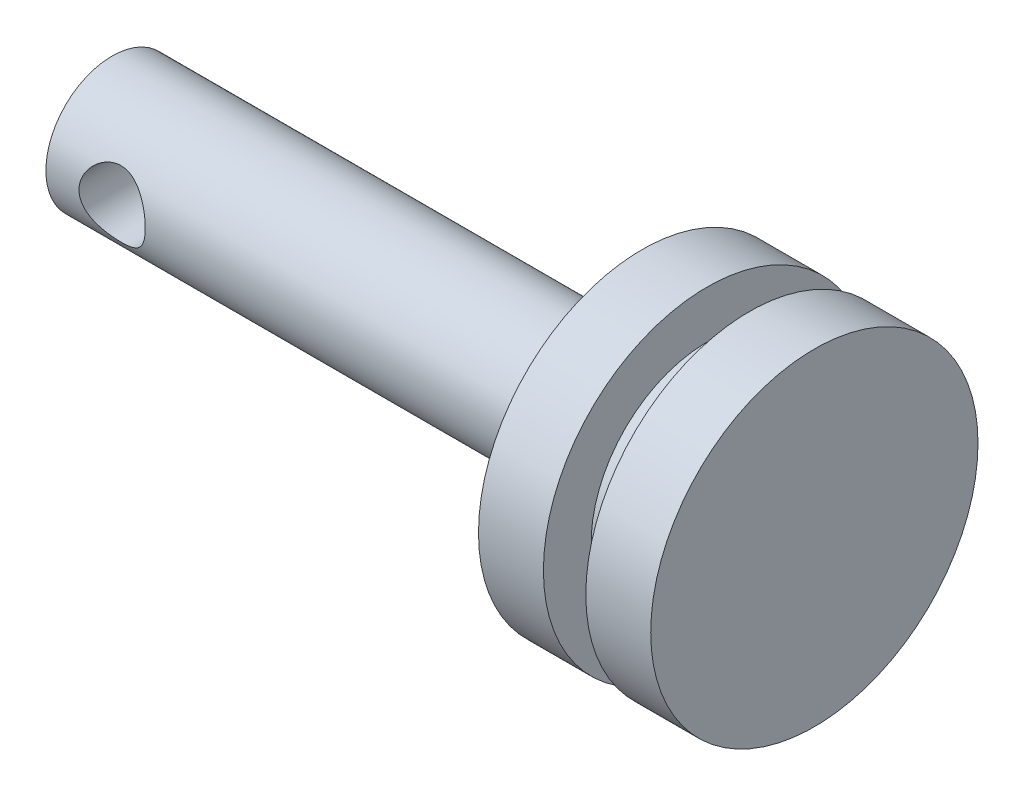
ISO-10303-21;
HEADER;
FILE_DESCRIPTION(('STEP AP214'),'2;1');
FILE_NAME('part.step','',(''),(''),'','','');
FILE_SCHEMA(('AUTOMOTIVE_DESIGN { 1 0 10303 214 1 1 1 1 }'));
ENDSEC;
DATA;
#1=APPLICATION_CONTEXT('core data for automotive mechanical design processes');
#2=APPLICATION_PROTOCOL_DEFINITION('international standard','automotive_design',2000,#1);
#3=PRODUCT_CONTEXT('',#1,'mechanical');
#4=PRODUCT('Part','Part','',(#3));
#5=PRODUCT_RELATED_PRODUCT_CATEGORY('part','',(#4));
#6=PRODUCT_DEFINITION_FORMATION('','',#4);
#7=PRODUCT_DEFINITION_CONTEXT('part definition',#1,'design');
#8=PRODUCT_DEFINITION('design','',#6,#7);
#9=PRODUCT_DEFINITION_SHAPE('','',#8);
#10=(LENGTH_UNIT() NAMED_UNIT(*) SI_UNIT(.MILLI.,.METRE.));
#11=(NAMED_UNIT(*) PLANE_ANGLE_UNIT() SI_UNIT($,.RADIAN.));
#12=(NAMED_UNIT(*) SI_UNIT($,.STERADIAN.) SOLID_ANGLE_UNIT());
#13=UNCERTAINTY_MEASURE_WITH_UNIT(LENGTH_MEASURE(1.E-05),#10,'distance_accuracy_value','');
#14=(GEOMETRIC_REPRESENTATION_CONTEXT(3) GLOBAL_UNCERTAINTY_ASSIGNED_CONTEXT((#13)) GLOBAL_UNIT_ASSIGNED_CONTEXT((#10,
#11,#12)) REPRESENTATION_CONTEXT('',''));
#15=CARTESIAN_POINT('',(0.,0.,0.));
#16=DIRECTION('',(0.,0.,1.));
#17=DIRECTION('',(1.,0.,0.));
#18=AXIS2_PLACEMENT_3D('',#15,#16,#17);
#19=CARTESIAN_POINT('',(53.,0.,0.));
#20=DIRECTION('',(1.,0.,0.));
#21=DIRECTION('',(0.,0.,-1.));
#22=AXIS2_PLACEMENT_3D('',#19,#20,#21);
#23=CYLINDRICAL_SURFACE('',#22,5.);
#24=CARTESIAN_POINT('',(2.5,0.,5.));
#25=CARTESIAN_POINT('',(2.50000966905601,0.131426682334305,4.99999177550472));
#26=CARTESIAN_POINT('',(2.51042556177403,0.263015634437212,4.99476199135277));
#27=CARTESIAN_POINT('',(2.55163182116205,0.522301454622882,4.9743541856102));
#28=CARTESIAN_POINT('',(2.58246088092502,0.649990448564104,4.9591572718767));
#29=CARTESIAN_POINT('',(2.66298462271884,0.897333631316202,4.92040690922477));
#30=CARTESIAN_POINT('',(2.71260598778273,1.01701694536277,4.89688595907259));
#31=CARTESIAN_POINT('',(2.8289265262518,1.24618160399671,4.84364443325827));
#32=CARTESIAN_POINT('',(2.89562435314509,1.3556637520377,4.81392434644421));
#33=CARTESIAN_POINT('',(3.04879313164263,1.56876952630998,4.74890645050632));
#34=CARTESIAN_POINT('',(3.13621620022978,1.67163802294308,4.71337997659091));
#35=CARTESIAN_POINT('',(3.32630369598529,1.86194861703332,4.64149925776731));
#36=CARTESIAN_POINT('',(3.42897962884011,1.94937895911555,4.60514440566897));
#37=CARTESIAN_POINT('',(3.65620837444528,2.11312999967247,4.53247377945622));
#38=CARTESIAN_POINT('',(3.78184024603501,2.18806333849064,4.49637967412567));
#39=CARTESIAN_POINT('',(4.04591833979543,2.31542056761491,4.43214946943555));
#40=CARTESIAN_POINT('',(4.18435532176262,2.36786053751682,4.40400769020792));
#41=CARTESIAN_POINT('',(4.46166276359641,2.44533110537653,4.36144667591402));
#42=CARTESIAN_POINT('',(4.60001113017958,2.47181464267578,4.34630678958452));
#43=CARTESIAN_POINT('',(4.87994709443761,2.50106748329741,4.3295472487215));
#44=CARTESIAN_POINT('',(5.02153135217509,2.50386022093906,4.3279142335843));
#45=CARTESIAN_POINT('',(5.28571506079088,2.48671821792512,4.33777325642937));
#46=CARTESIAN_POINT('',(5.40856007805829,2.46946139884055,4.34771909154984));
#47=CARTESIAN_POINT('',(5.64930477343195,2.41734962264384,4.37690571834675));
#48=CARTESIAN_POINT('',(5.76720286326311,2.38248905974454,4.39614947079454));
#49=CARTESIAN_POINT('',(5.99807283141433,2.29552445096459,4.44218691031839));
#50=CARTESIAN_POINT('',(6.11086599696452,2.24303766778987,4.46914601659993));
#51=CARTESIAN_POINT('',(6.32658573147497,2.12260421917012,4.52758510703513));
#52=CARTESIAN_POINT('',(6.42950783900021,2.0546506095312,4.55906711950478));
#53=CARTESIAN_POINT('',(6.63630313185808,1.89516513728194,4.62782894758213));
#54=CARTESIAN_POINT('',(6.7386421839404,1.8017361459232,4.66533775591865));
#55=CARTESIAN_POINT('',(6.92683854647725,1.59888894685344,4.73869058251019));
#56=CARTESIAN_POINT('',(7.0126879800847,1.48946314143571,4.77453379897003));
#57=CARTESIAN_POINT('',(7.16921415257432,1.25129126457962,4.84254968207409));
#58=CARTESIAN_POINT('',(7.23900118111435,1.12188397899853,4.87447460405015));
#59=CARTESIAN_POINT('',(7.35524257260752,0.851165538721986,4.92894702803109));
#60=CARTESIAN_POINT('',(7.4017154625379,0.709863940663163,4.95150197358893));
#61=CARTESIAN_POINT('',(7.4661885092917,0.431916229151782,4.98310834353579));
#62=CARTESIAN_POINT('',(7.486228089367,0.295853826370907,4.9931234575324));
#63=CARTESIAN_POINT('',(7.50366182783617,0.0219489998732898,5.00182533647794));
#64=CARTESIAN_POINT('',(7.50106671409849,-0.115892549675108,5.00051746803426));
#65=CARTESIAN_POINT('',(7.4744832789533,-0.378082429964654,4.98727980633468));
#66=CARTESIAN_POINT('',(7.45216866817559,-0.502648520123704,4.97618114219992));
#67=CARTESIAN_POINT('',(7.38940482026162,-0.74601723075597,4.94555428287529));
#68=CARTESIAN_POINT('',(7.34895358386411,-0.864819214231881,4.92602515837625));
#69=CARTESIAN_POINT('',(7.25000383391964,-1.09722152111965,4.87960628532329));
#70=CARTESIAN_POINT('',(7.19102237471768,-1.21057599249831,4.85252204417873));
#71=CARTESIAN_POINT('',(7.05723116087518,-1.42615340426438,4.7935993579975));
#72=CARTESIAN_POINT('',(6.98241466348012,-1.52837157450203,4.76175888940534));
#73=CARTESIAN_POINT('',(6.81059893670911,-1.72941922315487,4.69270553315087));
#74=CARTESIAN_POINT('',(6.7121428290248,-1.82693019428496,4.65527212009488));
#75=CARTESIAN_POINT('',(6.50018712195056,-2.0046408025722,4.58155978921587));
#76=CARTESIAN_POINT('',(6.38667720293014,-2.08482846428685,4.54528168472407));
#77=CARTESIAN_POINT('',(6.14089086451535,-2.22926978618994,4.4762798054528));
#78=CARTESIAN_POINT('',(6.00797183470886,-2.29256373922243,4.44381323981254));
#79=CARTESIAN_POINT('',(5.73122483111745,-2.39520706511459,4.38935180726746));
#80=CARTESIAN_POINT('',(5.58741118400001,-2.43458729077055,4.36734345549014));
#81=CARTESIAN_POINT('',(5.30772444263706,-2.48465421767005,4.33903752569351));
#82=CARTESIAN_POINT('',(5.17241436588103,-2.4977324874436,4.33143458674096));
#83=CARTESIAN_POINT('',(4.90138233261932,-2.50172288950898,4.32913386592579));
#84=CARTESIAN_POINT('',(4.76566058012637,-2.49264462983266,4.33443049025111));
#85=CARTESIAN_POINT('',(4.51129124438315,-2.45481530197331,4.35594655164663));
#86=CARTESIAN_POINT('',(4.39224881827924,-2.42802074302696,4.37107736338133));
#87=CARTESIAN_POINT('',(4.16047970780005,-2.35793843840543,4.40927540337602));
#88=CARTESIAN_POINT('',(4.04775506843346,-2.31464538728732,4.43234518434965));
#89=CARTESIAN_POINT('',(3.82343784728028,-2.20953919315538,4.48571326433413));
#90=CARTESIAN_POINT('',(3.71243014826499,-2.14667719009403,4.5163930799845));
#91=CARTESIAN_POINT('',(3.50181375675996,-2.0053780838799,4.58088327077455));
#92=CARTESIAN_POINT('',(3.40221103737127,-1.92693287765888,4.61469526970767));
#93=CARTESIAN_POINT('',(3.20464463625036,-1.74550556946065,4.68655816327011));
#94=CARTESIAN_POINT('',(3.10835063582863,-1.6407002246921,4.7246249151498));
#95=CARTESIAN_POINT('',(2.93434415057196,-1.41539785420684,4.79694347383545));
#96=CARTESIAN_POINT('',(2.85664168139412,-1.29489242426332,4.83119321905446));
#97=CARTESIAN_POINT('',(2.7219030205159,-1.03978808878536,4.89245149457782));
#98=CARTESIAN_POINT('',(2.66501683221555,-0.905095560782288,4.91940711437488));
#99=CARTESIAN_POINT('',(2.5978161412076,-0.696328709257352,4.95177960923351));
#100=CARTESIAN_POINT('',(2.57844460199819,-0.625670413494089,4.96122314081874));
#101=CARTESIAN_POINT('',(2.5459340516294,-0.482623997839259,4.97717127275101));
#102=CARTESIAN_POINT('',(2.53279123332365,-0.410236963092402,4.98367766823159));
#103=CARTESIAN_POINT('',(2.51526252771537,-0.281518684621671,4.9923820076613));
#104=CARTESIAN_POINT('',(2.50954506346868,-0.225408499555445,4.99523288466454));
#105=CARTESIAN_POINT('',(2.50191167053429,-0.112875528456288,4.99904367329659));
#106=CARTESIAN_POINT('',(2.49999584677453,-0.0564527338382178,5.00000353273198));
#107=CARTESIAN_POINT('',(2.5,0.,5.));
#108=B_SPLINE_CURVE_WITH_KNOTS('',3,(#24,#25,#26,#27,#28,#29,#30,#31,#32,#33,#34,#35,#36,#37,
#38,#39,#40,#41,#42,#43,#44,#45,#46,#47,#48,#49,#50,#51,#52,#53,#54,#55,#56,#57,#58,#59,#60,#61,
#62,#63,#64,#65,#66,#67,#68,#69,#70,#71,#72,#73,#74,#75,#76,#77,#78,#79,#80,#81,#82,#83,#84,#85,
#86,#87,#88,#89,#90,#91,#92,#93,#94,#95,#96,#97,#98,#99,#100,#101,#102,#103,#104,#105,#106,
#107),.UNSPECIFIED.,.T.,.F.,(4,2,2,2,2,2,2,2,2,2,2,2,2,2,2,2,2,2,2,2,2,2,2,2,2,2,2,2,2,2,2,2,2,
2,2,2,2,2,2,2,2,4),(0.,0.394060643550731,0.788870374272994,1.18215538873074,1.57540940145392,
1.99245439679522,2.40981559413509,2.85954316076882,3.30894869745702,3.73145030350574,
4.15353393322551,4.52514281023301,4.89687009814196,5.27725600421218,5.65781303150554,
6.08662353334696,6.51563836496715,6.96457555536101,7.41315542280698,7.82458226178364,
8.2358141127869,8.61517266265304,8.99457304077328,9.38482140069746,9.77523626870848,
10.2039902661037,10.6330397153795,11.0828670540368,11.53211279863,11.9382326875698,
12.3441764966106,12.7114482562151,13.0788382197025,13.4709114195009,13.8631890285845,
14.303131068923,14.7433095845248,15.1866003415819,15.407934939208,15.6291340766843,
15.7983933645035,15.9676573239323),.UNSPECIFIED.);
#109=CARTESIAN_POINT('',(2.5,0.,5.));
#110=VERTEX_POINT('',#109);
#111=EDGE_CURVE('E50',#110,#110,#108,.T.);
#112=ORIENTED_EDGE('',*,*,#111,.T.);
#113=EDGE_LOOP('',(#112));
#114=FACE_BOUND('',#113,.T.);
#115=CARTESIAN_POINT('',(0.,0.,0.));
#116=DIRECTION('',(1.,0.,0.));
#117=DIRECTION('',(0.,0.,-1.));
#118=AXIS2_PLACEMENT_3D('',#115,#116,#117);
#119=CIRCLE('',#118,5.);
#120=CARTESIAN_POINT('',(0.,0.,-5.));
#121=VERTEX_POINT('',#120);
#122=EDGE_CURVE('E10',#121,#121,#119,.T.);
#123=ORIENTED_EDGE('',*,*,#122,.T.);
#124=EDGE_LOOP('',(#123));
#125=FACE_BOUND('',#124,.T.);
#126=CARTESIAN_POINT('',(40.,0.,0.));
#127=DIRECTION('',(1.,0.,0.));
#128=DIRECTION('',(0.,0.,-1.));
#129=AXIS2_PLACEMENT_3D('',#126,#127,#128);
#130=CIRCLE('',#129,5.);
#131=CARTESIAN_POINT('',(40.,0.,-5.));
#132=VERTEX_POINT('',#131);
#133=EDGE_CURVE('E42',#132,#132,#130,.T.);
#134=ORIENTED_EDGE('',*,*,#133,.F.);
#135=EDGE_LOOP('',(#134));
#136=FACE_BOUND('',#135,.T.);
#137=CARTESIAN_POINT('',(2.5,0.,-5.));
#138=CARTESIAN_POINT('',(2.500009669056,-0.131426682334305,-4.99999177550472));
#139=CARTESIAN_POINT('',(2.51042556177403,-0.263015634437212,-4.99476199135277));
#140=CARTESIAN_POINT('',(2.55163182116205,-0.522301454622882,-4.9743541856102));
#141=CARTESIAN_POINT('',(2.58246088092502,-0.649990448564105,-4.9591572718767));
#142=CARTESIAN_POINT('',(2.66298462271884,-0.897333631316203,-4.92040690922477));
#143=CARTESIAN_POINT('',(2.71260598778273,-1.01701694536277,-4.89688595907259));
#144=CARTESIAN_POINT('',(2.8289265262518,-1.24618160399671,-4.84364443325827));
#145=CARTESIAN_POINT('',(2.89562435314509,-1.3556637520377,-4.81392434644421));
#146=CARTESIAN_POINT('',(3.04879313164263,-1.56876952630998,-4.74890645050632));
#147=CARTESIAN_POINT('',(3.13621620022978,-1.67163802294308,-4.71337997659091));
#148=CARTESIAN_POINT('',(3.32630369598529,-1.86194861703332,-4.64149925776731));
#149=CARTESIAN_POINT('',(3.42897962884011,-1.94937895911555,-4.60514440566897));
#150=CARTESIAN_POINT('',(3.65620837444528,-2.11312999967247,-4.53247377945622));
#151=CARTESIAN_POINT('',(3.78184024603501,-2.18806333849064,-4.49637967412567));
#152=CARTESIAN_POINT('',(4.04591833979543,-2.31542056761491,-4.43214946943555));
#153=CARTESIAN_POINT('',(4.18435532176262,-2.36786053751682,-4.40400769020792));
#154=CARTESIAN_POINT('',(4.46166276359641,-2.44533110537653,-4.36144667591402));
#155=CARTESIAN_POINT('',(4.60001113017958,-2.47181464267578,-4.34630678958452));
#156=CARTESIAN_POINT('',(4.87994709443761,-2.50106748329741,-4.3295472487215));
#157=CARTESIAN_POINT('',(5.02153135217509,-2.50386022093906,-4.3279142335843));
#158=CARTESIAN_POINT('',(5.28571506079088,-2.48671821792512,-4.33777325642937));
#159=CARTESIAN_POINT('',(5.40856007805829,-2.46946139884055,-4.34771909154984));
#160=CARTESIAN_POINT('',(5.64930477343195,-2.41734962264384,-4.37690571834675));
#161=CARTESIAN_POINT('',(5.76720286326311,-2.38248905974454,-4.39614947079454));
#162=CARTESIAN_POINT('',(5.99807283141433,-2.29552445096459,-4.44218691031839));
#163=CARTESIAN_POINT('',(6.11086599696452,-2.24303766778987,-4.46914601659993));
#164=CARTESIAN_POINT('',(6.32658573147497,-2.12260421917012,-4.52758510703513));
#165=CARTESIAN_POINT('',(6.42950783900021,-2.0546506095312,-4.55906711950478));
#166=CARTESIAN_POINT('',(6.63630313185808,-1.89516513728193,-4.62782894758213));
#167=CARTESIAN_POINT('',(6.7386421839404,-1.80173614592319,-4.66533775591865));
#168=CARTESIAN_POINT('',(6.92683854647725,-1.59888894685344,-4.73869058251019));
#169=CARTESIAN_POINT('',(7.0126879800847,-1.48946314143571,-4.77453379897003));
#170=CARTESIAN_POINT('',(7.16921415257432,-1.25129126457962,-4.84254968207409));
#171=CARTESIAN_POINT('',(7.23900118111436,-1.12188397899853,-4.87447460405015));
#172=CARTESIAN_POINT('',(7.35524257260752,-0.851165538721984,-4.92894702803109));
#173=CARTESIAN_POINT('',(7.4017154625379,-0.709863940663161,-4.95150197358893));
#174=CARTESIAN_POINT('',(7.4661885092917,-0.43191622915178,-4.98310834353579));
#175=CARTESIAN_POINT('',(7.486228089367,-0.295853826370905,-4.9931234575324));
#176=CARTESIAN_POINT('',(7.50366182783617,-0.0219489998732879,-5.00182533647794));
#177=CARTESIAN_POINT('',(7.50106671409849,0.115892549675109,-5.00051746803426));
#178=CARTESIAN_POINT('',(7.4744832789533,0.378082429964656,-4.98727980633468));
#179=CARTESIAN_POINT('',(7.4521686681756,0.502648520123706,-4.97618114219992));
#180=CARTESIAN_POINT('',(7.38940482026162,0.746017230755971,-4.94555428287529));
#181=CARTESIAN_POINT('',(7.3489535838641,0.864819214231883,-4.92602515837625));
#182=CARTESIAN_POINT('',(7.25000383391964,1.09722152111965,-4.87960628532329));
#183=CARTESIAN_POINT('',(7.19102237471768,1.21057599249831,-4.85252204417873));
#184=CARTESIAN_POINT('',(7.05723116087518,1.42615340426439,-4.7935993579975));
#185=CARTESIAN_POINT('',(6.98241466348011,1.52837157450203,-4.76175888940534));
#186=CARTESIAN_POINT('',(6.81059893670911,1.72941922315487,-4.69270553315087));
#187=CARTESIAN_POINT('',(6.7121428290248,1.82693019428496,-4.65527212009488));
#188=CARTESIAN_POINT('',(6.50018712195056,2.0046408025722,-4.58155978921587));
#189=CARTESIAN_POINT('',(6.38667720293013,2.08482846428685,-4.54528168472407));
#190=CARTESIAN_POINT('',(6.14089086451535,2.22926978618995,-4.4762798054528));
#191=CARTESIAN_POINT('',(6.00797183470886,2.29256373922243,-4.44381323981254));
#192=CARTESIAN_POINT('',(5.73122483111745,2.39520706511459,-4.38935180726746));
#193=CARTESIAN_POINT('',(5.58741118400001,2.43458729077055,-4.36734345549014));
#194=CARTESIAN_POINT('',(5.30772444263706,2.48465421767005,-4.33903752569351));
#195=CARTESIAN_POINT('',(5.17241436588103,2.4977324874436,-4.33143458674096));
#196=CARTESIAN_POINT('',(4.90138233261932,2.50172288950898,-4.32913386592579));
#197=CARTESIAN_POINT('',(4.76566058012637,2.49264462983266,-4.33443049025111));
#198=CARTESIAN_POINT('',(4.51129124438315,2.45481530197331,-4.35594655164663));
#199=CARTESIAN_POINT('',(4.39224881827924,2.42802074302696,-4.37107736338133));
#200=CARTESIAN_POINT('',(4.16047970780005,2.35793843840543,-4.40927540337602));
#201=CARTESIAN_POINT('',(4.04775506843346,2.31464538728732,-4.43234518434965));
#202=CARTESIAN_POINT('',(3.82343784728028,2.20953919315538,-4.48571326433413));
#203=CARTESIAN_POINT('',(3.71243014826498,2.14667719009403,-4.5163930799845));
#204=CARTESIAN_POINT('',(3.50181375675996,2.0053780838799,-4.58088327077455));
#205=CARTESIAN_POINT('',(3.40221103737127,1.92693287765888,-4.61469526970767));
#206=CARTESIAN_POINT('',(3.20464463625036,1.74550556946065,-4.68655816327011));
#207=CARTESIAN_POINT('',(3.10835063582863,1.6407002246921,-4.7246249151498));
#208=CARTESIAN_POINT('',(2.93434415057196,1.41539785420684,-4.79694347383545));
#209=CARTESIAN_POINT('',(2.85664168139412,1.29489242426332,-4.83119321905446));
#210=CARTESIAN_POINT('',(2.7219030205159,1.03978808878536,-4.89245149457782));
#211=CARTESIAN_POINT('',(2.66501683221555,0.905095560782287,-4.91940711437488));
#212=CARTESIAN_POINT('',(2.5978161412076,0.696328709257351,-4.95177960923351));
#213=CARTESIAN_POINT('',(2.57844460199819,0.625670413494088,-4.96122314081874));
#214=CARTESIAN_POINT('',(2.5459340516294,0.482623997839258,-4.97717127275101));
#215=CARTESIAN_POINT('',(2.53279123332365,0.410236963092401,-4.98367766823159));
#216=CARTESIAN_POINT('',(2.51526252771537,0.281518684621671,-4.9923820076613));
#217=CARTESIAN_POINT('',(2.50954506346868,0.225408499555444,-4.99523288466454));
#218=CARTESIAN_POINT('',(2.50191167053429,0.112875528456288,-4.99904367329659));
#219=CARTESIAN_POINT('',(2.49999584677452,0.0564527338382176,-5.00000353273198));
#220=CARTESIAN_POINT('',(2.5,0.,-5.));
#221=B_SPLINE_CURVE_WITH_KNOTS('',3,(#137,#138,#139,#140,#141,#142,#143,#144,#145,#146,#147,
#148,#149,#150,#151,#152,#153,#154,#155,#156,#157,#158,#159,#160,#161,#162,#163,#164,#165,#166,
#167,#168,#169,#170,#171,#172,#173,#174,#175,#176,#177,#178,#179,#180,#181,#182,#183,#184,#185,
#186,#187,#188,#189,#190,#191,#192,#193,#194,#195,#196,#197,#198,#199,#200,#201,#202,#203,#204,
#205,#206,#207,#208,#209,#210,#211,#212,#213,#214,#215,#216,#217,#218,#219,#220),.UNSPECIFIED.,
.T.,.F.,(4,2,2,2,2,2,2,2,2,2,2,2,2,2,2,2,2,2,2,2,2,2,2,2,2,2,2,2,2,2,2,2,2,2,2,2,2,2,2,2,2,4),
(0.,0.394060643550731,0.788870374272994,1.18215538873075,1.57540940145392,1.99245439679522,
2.40981559413509,2.85954316076882,3.30894869745702,3.73145030350574,4.15353393322551,
4.52514281023301,4.89687009814196,5.27725600421218,5.65781303150554,6.08662353334696,
6.51563836496716,6.96457555536102,7.41315542280699,7.82458226178364,8.2358141127869,
8.61517266265305,8.99457304077329,9.38482140069747,9.77523626870848,10.2039902661037,
10.6330397153795,11.0828670540368,11.53211279863,11.9382326875698,12.3441764966106,
12.7114482562151,13.0788382197025,13.4709114195009,13.8631890285845,14.303131068923,
14.7433095845248,15.1866003415819,15.407934939208,15.6291340766843,15.7983933645035,
15.9676573239322),.UNSPECIFIED.);
#222=CARTESIAN_POINT('',(2.5,0.,-5.));
#223=VERTEX_POINT('',#222);
#224=EDGE_CURVE('E34',#223,#223,#221,.T.);
#225=ORIENTED_EDGE('',*,*,#224,.T.);
#226=EDGE_LOOP('',(#225));
#227=FACE_BOUND('',#226,.T.);
#228=ADVANCED_FACE('F30',(#114,#125,#136,#227),#23,.T.);
#229=CARTESIAN_POINT('',(0.,0.,0.));
#230=DIRECTION('',(-1.,0.,0.));
#231=DIRECTION('',(0.,0.,1.));
#232=AXIS2_PLACEMENT_3D('',#229,#230,#231);
#233=PLANE('',#232);
#234=ORIENTED_EDGE('',*,*,#122,.F.);
#235=EDGE_LOOP('',(#234));
#236=FACE_BOUND('',#235,.T.);
#237=ADVANCED_FACE('F32',(#236),#233,.T.);
#238=CARTESIAN_POINT('',(40.,5.,0.));
#239=DIRECTION('',(-1.,0.,0.));
#240=DIRECTION('',(0.,0.,1.));
#241=AXIS2_PLACEMENT_3D('',#238,#239,#240);
#242=PLANE('',#241);
#243=ORIENTED_EDGE('',*,*,#133,.T.);
#244=EDGE_LOOP('',(#243));
#245=FACE_BOUND('',#244,.T.);
#246=CARTESIAN_POINT('',(40.,0.,0.));
#247=DIRECTION('',(1.,0.,0.));
#248=DIRECTION('',(0.,0.,-1.));
#249=AXIS2_PLACEMENT_3D('',#246,#247,#248);
#250=CIRCLE('',#249,12.35);
#251=CARTESIAN_POINT('',(40.,0.,-12.35));
#252=VERTEX_POINT('',#251);
#253=EDGE_CURVE('E47',#252,#252,#250,.T.);
#254=ORIENTED_EDGE('',*,*,#253,.F.);
#255=EDGE_LOOP('',(#254));
#256=FACE_BOUND('',#255,.T.);
#257=ADVANCED_FACE('F85',(#245,#256),#242,.T.);
#258=CARTESIAN_POINT('',(53.,0.,0.));
#259=DIRECTION('',(1.,0.,0.));
#260=DIRECTION('',(0.,0.,-1.));
#261=AXIS2_PLACEMENT_3D('',#258,#259,#260);
#262=CYLINDRICAL_SURFACE('',#261,12.35);
#263=ORIENTED_EDGE('',*,*,#253,.T.);
#264=EDGE_LOOP('',(#263));
#265=FACE_BOUND('',#264,.T.);
#266=CARTESIAN_POINT('',(44.9,0.,0.));
#267=DIRECTION('',(1.,0.,0.));
#268=DIRECTION('',(0.,0.,-1.));
#269=AXIS2_PLACEMENT_3D('',#266,#267,#268);
#270=CIRCLE('',#269,12.35);
#271=CARTESIAN_POINT('',(44.9,0.,-12.35));
#272=VERTEX_POINT('',#271);
#273=EDGE_CURVE('E118',#272,#272,#270,.T.);
#274=ORIENTED_EDGE('',*,*,#273,.F.);
#275=EDGE_LOOP('',(#274));
#276=FACE_BOUND('',#275,.T.);
#277=ADVANCED_FACE('F82',(#265,#276),#262,.T.);
#278=CARTESIAN_POINT('',(44.9,12.35,0.));
#279=DIRECTION('',(1.,0.,0.));
#280=DIRECTION('',(0.,0.,-1.));
#281=AXIS2_PLACEMENT_3D('',#278,#279,#280);
#282=PLANE('',#281);
#283=ORIENTED_EDGE('',*,*,#273,.T.);
#284=EDGE_LOOP('',(#283));
#285=FACE_BOUND('',#284,.T.);
#286=CARTESIAN_POINT('',(44.9,0.,0.));
#287=DIRECTION('',(1.,0.,0.));
#288=DIRECTION('',(0.,0.,-1.));
#289=AXIS2_PLACEMENT_3D('',#286,#287,#288);
#290=CIRCLE('',#289,8.75);
#291=CARTESIAN_POINT('',(44.9,0.,-8.75));
#292=VERTEX_POINT('',#291);
#293=EDGE_CURVE('E115',#292,#292,#290,.T.);
#294=ORIENTED_EDGE('',*,*,#293,.F.);
#295=EDGE_LOOP('',(#294));
#296=FACE_BOUND('',#295,.T.);
#297=ADVANCED_FACE('F78',(#285,#296),#282,.T.);
#298=CARTESIAN_POINT('',(53.,0.,0.));
#299=DIRECTION('',(1.,0.,0.));
#300=DIRECTION('',(0.,0.,-1.));
#301=AXIS2_PLACEMENT_3D('',#298,#299,#300);
#302=CYLINDRICAL_SURFACE('',#301,8.75);
#303=ORIENTED_EDGE('',*,*,#293,.T.);
#304=EDGE_LOOP('',(#303));
#305=FACE_BOUND('',#304,.T.);
#306=CARTESIAN_POINT('',(48.1,0.,0.));
#307=DIRECTION('',(1.,0.,0.));
#308=DIRECTION('',(0.,0.,-1.));
#309=AXIS2_PLACEMENT_3D('',#306,#307,#308);
#310=CIRCLE('',#309,8.75);
#311=CARTESIAN_POINT('',(48.1,0.,-8.75));
#312=VERTEX_POINT('',#311);
#313=EDGE_CURVE('E110',#312,#312,#310,.T.);
#314=ORIENTED_EDGE('',*,*,#313,.F.);
#315=EDGE_LOOP('',(#314));
#316=FACE_BOUND('',#315,.T.);
#317=ADVANCED_FACE('F74',(#305,#316),#302,.T.);
#318=CARTESIAN_POINT('',(48.1,8.75,0.));
#319=DIRECTION('',(-1.,0.,0.));
#320=DIRECTION('',(0.,0.,1.));
#321=AXIS2_PLACEMENT_3D('',#318,#319,#320);
#322=PLANE('',#321);
#323=ORIENTED_EDGE('',*,*,#313,.T.);
#324=EDGE_LOOP('',(#323));
#325=FACE_BOUND('',#324,.T.);
#326=CARTESIAN_POINT('',(48.1,0.,0.));
#327=DIRECTION('',(1.,0.,0.));
#328=DIRECTION('',(0.,0.,-1.));
#329=AXIS2_PLACEMENT_3D('',#326,#327,#328);
#330=CIRCLE('',#329,12.35);
#331=CARTESIAN_POINT('',(48.1,0.,-12.35));
#332=VERTEX_POINT('',#331);
#333=EDGE_CURVE('E106',#332,#332,#330,.T.);
#334=ORIENTED_EDGE('',*,*,#333,.F.);
#335=EDGE_LOOP('',(#334));
#336=FACE_BOUND('',#335,.T.);
#337=ADVANCED_FACE('F70',(#325,#336),#322,.T.);
#338=CARTESIAN_POINT('',(53.,0.,0.));
#339=DIRECTION('',(1.,0.,0.));
#340=DIRECTION('',(0.,0.,-1.));
#341=AXIS2_PLACEMENT_3D('',#338,#339,#340);
#342=CYLINDRICAL_SURFACE('',#341,12.35);
#343=ORIENTED_EDGE('',*,*,#333,.T.);
#344=EDGE_LOOP('',(#343));
#345=FACE_BOUND('',#344,.T.);
#346=CARTESIAN_POINT('',(53.,0.,0.));
#347=DIRECTION('',(1.,0.,0.));
#348=DIRECTION('',(0.,0.,-1.));
#349=AXIS2_PLACEMENT_3D('',#346,#347,#348);
#350=CIRCLE('',#349,12.35);
#351=CARTESIAN_POINT('',(53.,0.,-12.35));
#352=VERTEX_POINT('',#351);
#353=EDGE_CURVE('E104',#352,#352,#350,.T.);
#354=ORIENTED_EDGE('',*,*,#353,.F.);
#355=EDGE_LOOP('',(#354));
#356=FACE_BOUND('',#355,.T.);
#357=ADVANCED_FACE('F66',(#345,#356),#342,.T.);
#358=CARTESIAN_POINT('',(53.,12.35,0.));
#359=DIRECTION('',(1.,0.,0.));
#360=DIRECTION('',(0.,0.,-1.));
#361=AXIS2_PLACEMENT_3D('',#358,#359,#360);
#362=PLANE('',#361);
#363=ORIENTED_EDGE('',*,*,#353,.T.);
#364=EDGE_LOOP('',(#363));
#365=FACE_BOUND('',#364,.T.);
#366=ADVANCED_FACE('F61',(#365),#362,.T.);
#367=CARTESIAN_POINT('',(5.,0.,10.));
#368=DIRECTION('',(0.,0.,-1.));
#369=DIRECTION('',(-1.,0.,0.));
#370=AXIS2_PLACEMENT_3D('',#367,#368,#369);
#371=CYLINDRICAL_SURFACE('',#370,2.5);
#372=ORIENTED_EDGE('',*,*,#224,.F.);
#373=EDGE_LOOP('',(#372));
#374=FACE_BOUND('',#373,.T.);
#375=ORIENTED_EDGE('',*,*,#111,.F.);
#376=EDGE_LOOP('',(#375));
#377=FACE_BOUND('',#376,.T.);
#378=ADVANCED_FACE('F57',(#374,#377),#371,.F.);
#379=CLOSED_SHELL('',(#228,#237,#257,#277,#297,#317,#337,#357,#366,#378));
#380=MANIFOLD_SOLID_BREP('B2',#379);
#381=ADVANCED_BREP_SHAPE_REPRESENTATION('',(#18,#380),#14);
#382=SHAPE_DEFINITION_REPRESENTATION(#9,#381);
ENDSEC;
END-ISO-10303-21;
